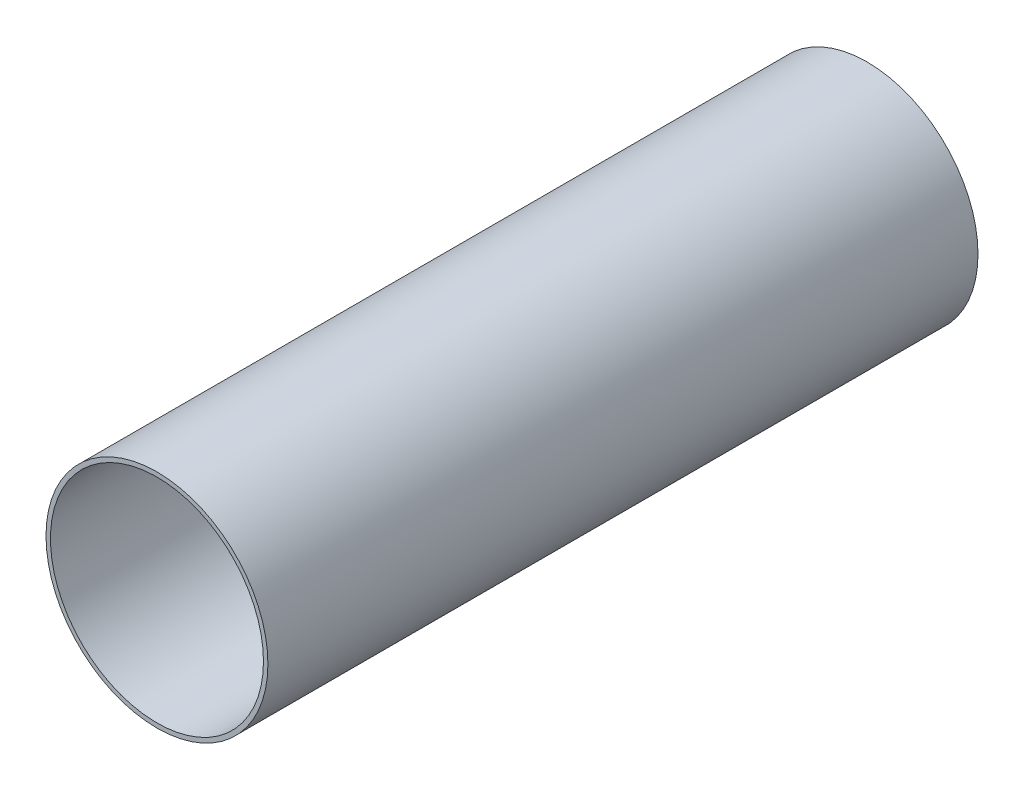
ISO-10303-21;
HEADER;
FILE_DESCRIPTION(('STEP AP214'),'2;1');
FILE_NAME('part.step','',(''),(''),'','','');
FILE_SCHEMA(('AUTOMOTIVE_DESIGN { 1 0 10303 214 1 1 1 1 }'));
ENDSEC;
DATA;
#1=APPLICATION_CONTEXT('core data for automotive mechanical design processes');
#2=APPLICATION_PROTOCOL_DEFINITION('international standard','automotive_design',2000,#1);
#3=PRODUCT_CONTEXT('',#1,'mechanical');
#4=PRODUCT('Part','Part','',(#3));
#5=PRODUCT_RELATED_PRODUCT_CATEGORY('part','',(#4));
#6=PRODUCT_DEFINITION_FORMATION('','',#4);
#7=PRODUCT_DEFINITION_CONTEXT('part definition',#1,'design');
#8=PRODUCT_DEFINITION('design','',#6,#7);
#9=PRODUCT_DEFINITION_SHAPE('','',#8);
#10=(LENGTH_UNIT() NAMED_UNIT(*) SI_UNIT(.MILLI.,.METRE.));
#11=(NAMED_UNIT(*) PLANE_ANGLE_UNIT() SI_UNIT($,.RADIAN.));
#12=(NAMED_UNIT(*) SI_UNIT($,.STERADIAN.) SOLID_ANGLE_UNIT());
#13=UNCERTAINTY_MEASURE_WITH_UNIT(LENGTH_MEASURE(1.E-05),#10,'distance_accuracy_value','');
#14=(GEOMETRIC_REPRESENTATION_CONTEXT(3) GLOBAL_UNCERTAINTY_ASSIGNED_CONTEXT((#13)) GLOBAL_UNIT_ASSIGNED_CONTEXT((#10,
#11,#12)) REPRESENTATION_CONTEXT('',''));
#15=CARTESIAN_POINT('',(0.,0.,0.));
#16=DIRECTION('',(0.,0.,1.));
#17=DIRECTION('',(1.,0.,0.));
#18=AXIS2_PLACEMENT_3D('',#15,#16,#17);
#19=CARTESIAN_POINT('',(0.,0.,160.));
#20=DIRECTION('',(0.,0.,1.));
#21=DIRECTION('',(1.,0.,0.));
#22=AXIS2_PLACEMENT_3D('',#19,#20,#21);
#23=PLANE('',#22);
#24=CARTESIAN_POINT('',(0.,0.,160.));
#25=DIRECTION('',(0.,0.,1.));
#26=DIRECTION('',(1.,0.,0.));
#27=AXIS2_PLACEMENT_3D('',#24,#25,#26);
#28=CIRCLE('',#27,25.);
#29=CARTESIAN_POINT('',(25.,0.,160.));
#30=VERTEX_POINT('',#29);
#31=EDGE_CURVE('E10',#30,#30,#28,.T.);
#32=ORIENTED_EDGE('',*,*,#31,.T.);
#33=EDGE_LOOP('',(#32));
#34=FACE_BOUND('',#33,.T.);
#35=CARTESIAN_POINT('',(0.,0.,160.));
#36=DIRECTION('',(0.,0.,1.));
#37=DIRECTION('',(1.,0.,0.));
#38=AXIS2_PLACEMENT_3D('',#35,#36,#37);
#39=CIRCLE('',#38,24.);
#40=CARTESIAN_POINT('',(24.,0.,160.));
#41=VERTEX_POINT('',#40);
#42=EDGE_CURVE('E42',#41,#41,#39,.T.);
#43=ORIENTED_EDGE('',*,*,#42,.F.);
#44=EDGE_LOOP('',(#43));
#45=FACE_BOUND('',#44,.T.);
#46=ADVANCED_FACE('F31',(#34,#45),#23,.T.);
#47=CARTESIAN_POINT('',(0.,0.,0.));
#48=DIRECTION('',(0.,0.,1.));
#49=DIRECTION('',(1.,0.,0.));
#50=AXIS2_PLACEMENT_3D('',#47,#48,#49);
#51=PLANE('',#50);
#52=CARTESIAN_POINT('',(0.,0.,0.));
#53=DIRECTION('',(0.,0.,1.));
#54=DIRECTION('',(1.,0.,0.));
#55=AXIS2_PLACEMENT_3D('',#52,#53,#54);
#56=CIRCLE('',#55,25.);
#57=CARTESIAN_POINT('',(25.,0.,0.));
#58=VERTEX_POINT('',#57);
#59=EDGE_CURVE('E35',#58,#58,#56,.T.);
#60=ORIENTED_EDGE('',*,*,#59,.F.);
#61=EDGE_LOOP('',(#60));
#62=FACE_BOUND('',#61,.T.);
#63=CARTESIAN_POINT('',(0.,0.,0.));
#64=DIRECTION('',(0.,0.,1.));
#65=DIRECTION('',(1.,0.,0.));
#66=AXIS2_PLACEMENT_3D('',#63,#64,#65);
#67=CIRCLE('',#66,24.);
#68=CARTESIAN_POINT('',(24.,0.,0.));
#69=VERTEX_POINT('',#68);
#70=EDGE_CURVE('E44',#69,#69,#67,.T.);
#71=ORIENTED_EDGE('',*,*,#70,.T.);
#72=EDGE_LOOP('',(#71));
#73=FACE_BOUND('',#72,.T.);
#74=ADVANCED_FACE('F54',(#62,#73),#51,.F.);
#75=CARTESIAN_POINT('',(0.,0.,160.));
#76=DIRECTION('',(0.,0.,-1.));
#77=DIRECTION('',(-1.,0.,0.));
#78=AXIS2_PLACEMENT_3D('',#75,#76,#77);
#79=CYLINDRICAL_SURFACE('',#78,25.);
#80=ORIENTED_EDGE('',*,*,#31,.F.);
#81=EDGE_LOOP('',(#80));
#82=FACE_BOUND('',#81,.T.);
#83=ORIENTED_EDGE('',*,*,#59,.T.);
#84=EDGE_LOOP('',(#83));
#85=FACE_BOUND('',#84,.T.);
#86=ADVANCED_FACE('F33',(#82,#85),#79,.T.);
#87=CARTESIAN_POINT('',(0.,0.,160.));
#88=DIRECTION('',(0.,0.,-1.));
#89=DIRECTION('',(-1.,0.,0.));
#90=AXIS2_PLACEMENT_3D('',#87,#88,#89);
#91=CYLINDRICAL_SURFACE('',#90,24.);
#92=ORIENTED_EDGE('',*,*,#42,.T.);
#93=EDGE_LOOP('',(#92));
#94=FACE_BOUND('',#93,.T.);
#95=ORIENTED_EDGE('',*,*,#70,.F.);
#96=EDGE_LOOP('',(#95));
#97=FACE_BOUND('',#96,.T.);
#98=ADVANCED_FACE('F50',(#94,#97),#91,.F.);
#99=CLOSED_SHELL('',(#46,#74,#86,#98));
#100=MANIFOLD_SOLID_BREP('B2',#99);
#101=ADVANCED_BREP_SHAPE_REPRESENTATION('',(#18,#100),#14);
#102=SHAPE_DEFINITION_REPRESENTATION(#9,#101);
ENDSEC;
END-ISO-10303-21;
